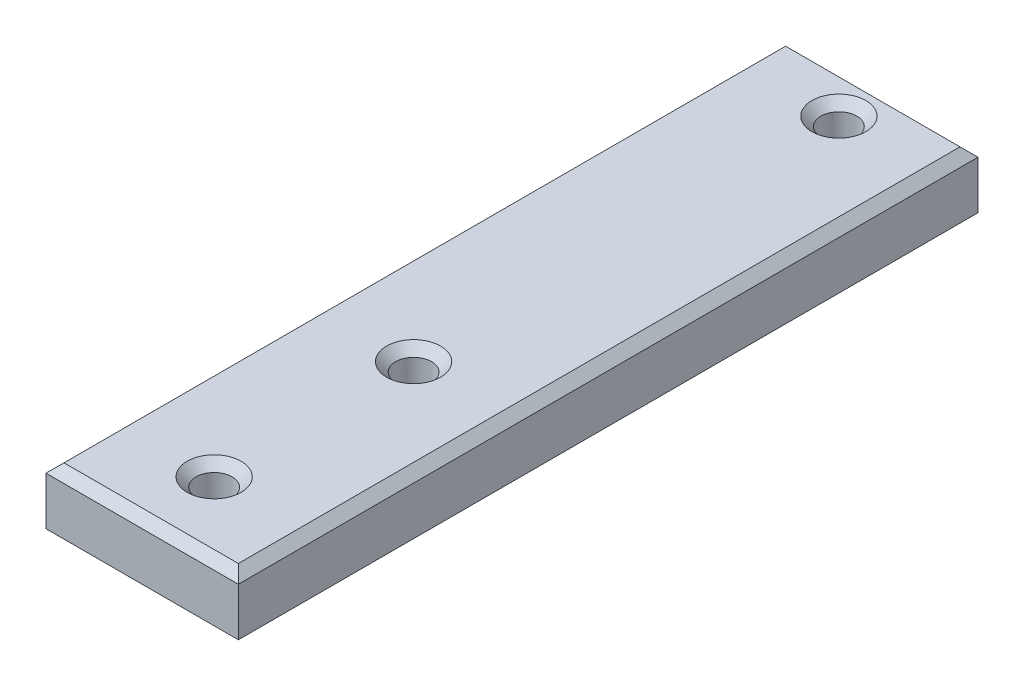
ISO-10303-21;
HEADER;
FILE_DESCRIPTION(('STEP AP214'),'2;1');
FILE_NAME('part.step','',(''),(''),'','','');
FILE_SCHEMA(('AUTOMOTIVE_DESIGN { 1 0 10303 214 1 1 1 1 }'));
ENDSEC;
DATA;
#1=APPLICATION_CONTEXT('core data for automotive mechanical design processes');
#2=APPLICATION_PROTOCOL_DEFINITION('international standard','automotive_design',2000,#1);
#3=PRODUCT_CONTEXT('',#1,'mechanical');
#4=PRODUCT('Part','Part','',(#3));
#5=PRODUCT_RELATED_PRODUCT_CATEGORY('part','',(#4));
#6=PRODUCT_DEFINITION_FORMATION('','',#4);
#7=PRODUCT_DEFINITION_CONTEXT('part definition',#1,'design');
#8=PRODUCT_DEFINITION('design','',#6,#7);
#9=PRODUCT_DEFINITION_SHAPE('','',#8);
#10=(LENGTH_UNIT() NAMED_UNIT(*) SI_UNIT(.MILLI.,.METRE.));
#11=(NAMED_UNIT(*) PLANE_ANGLE_UNIT() SI_UNIT($,.RADIAN.));
#12=(NAMED_UNIT(*) SI_UNIT($,.STERADIAN.) SOLID_ANGLE_UNIT());
#13=UNCERTAINTY_MEASURE_WITH_UNIT(LENGTH_MEASURE(1.E-05),#10,'distance_accuracy_value','');
#14=(GEOMETRIC_REPRESENTATION_CONTEXT(3) GLOBAL_UNCERTAINTY_ASSIGNED_CONTEXT((#13)) GLOBAL_UNIT_ASSIGNED_CONTEXT((#10,
#11,#12)) REPRESENTATION_CONTEXT('',''));
#15=CARTESIAN_POINT('',(0.,0.,0.));
#16=DIRECTION('',(0.,0.,1.));
#17=DIRECTION('',(1.,0.,0.));
#18=AXIS2_PLACEMENT_3D('',#15,#16,#17);
#19=CARTESIAN_POINT('',(0.,6.35,0.));
#20=DIRECTION('',(0.,1.,0.));
#21=DIRECTION('',(0.,0.,1.));
#22=AXIS2_PLACEMENT_3D('',#19,#20,#21);
#23=PLANE('',#22);
#24=CARTESIAN_POINT('',(0.,6.35,26.95));
#25=DIRECTION('',(0.,1.,0.));
#26=DIRECTION('',(0.,0.,1.));
#27=AXIS2_PLACEMENT_3D('',#24,#25,#26);
#28=CIRCLE('',#27,3.00000000000001);
#29=CARTESIAN_POINT('',(0.,6.35,29.95));
#30=VERTEX_POINT('',#29);
#31=EDGE_CURVE('E174',#30,#30,#28,.F.);
#32=ORIENTED_EDGE('',*,*,#31,.T.);
#33=EDGE_LOOP('',(#32));
#34=FACE_BOUND('',#33,.T.);
#35=CARTESIAN_POINT('',(0.,6.35,-42.5));
#36=DIRECTION('',(0.,1.,0.));
#37=DIRECTION('',(0.,0.,1.));
#38=AXIS2_PLACEMENT_3D('',#35,#36,#37);
#39=CIRCLE('',#38,3.00000000000001);
#40=CARTESIAN_POINT('',(0.,6.35,-39.5));
#41=VERTEX_POINT('',#40);
#42=EDGE_CURVE('E170',#41,#41,#39,.F.);
#43=ORIENTED_EDGE('',*,*,#42,.T.);
#44=EDGE_LOOP('',(#43));
#45=FACE_BOUND('',#44,.T.);
#46=DIRECTION('',(1.,0.,0.));
#47=VECTOR('',#46,1.);
#48=CARTESIAN_POINT('',(10.6922410208794,6.35,33.95));
#49=LINE('',#48,#47);
#50=CARTESIAN_POINT('',(-9.6922410208794,6.35,33.95));
#51=VERTEX_POINT('',#50);
#52=CARTESIAN_POINT('',(9.6922410208794,6.35,33.95));
#53=VERTEX_POINT('',#52);
#54=EDGE_CURVE('E163',#51,#53,#49,.T.);
#55=ORIENTED_EDGE('',*,*,#54,.T.);
#56=DIRECTION('',(0.,0.,-1.));
#57=VECTOR('',#56,1.);
#58=CARTESIAN_POINT('',(9.69224102087942,6.35,-47.275));
#59=LINE('',#58,#57);
#60=CARTESIAN_POINT('',(9.69224102087942,6.35,-46.275));
#61=VERTEX_POINT('',#60);
#62=EDGE_CURVE('E166',#53,#61,#59,.T.);
#63=ORIENTED_EDGE('',*,*,#62,.T.);
#64=DIRECTION('',(-1.,0.,0.));
#65=VECTOR('',#64,1.);
#66=CARTESIAN_POINT('',(-10.6922410208794,6.35,-46.275));
#67=LINE('',#66,#65);
#68=CARTESIAN_POINT('',(-9.69224102087942,6.35,-46.275));
#69=VERTEX_POINT('',#68);
#70=EDGE_CURVE('E157',#61,#69,#67,.T.);
#71=ORIENTED_EDGE('',*,*,#70,.T.);
#72=DIRECTION('',(0.,0.,1.));
#73=VECTOR('',#72,1.);
#74=CARTESIAN_POINT('',(-9.6922410208794,6.35,34.95));
#75=LINE('',#74,#73);
#76=EDGE_CURVE('E160',#69,#51,#75,.T.);
#77=ORIENTED_EDGE('',*,*,#76,.T.);
#78=EDGE_LOOP('',(#55,#63,#71,#77));
#79=FACE_BOUND('',#78,.T.);
#80=CARTESIAN_POINT('',(0.,6.35,4.77499999999999));
#81=DIRECTION('',(0.,1.,0.));
#82=DIRECTION('',(0.,0.,1.));
#83=AXIS2_PLACEMENT_3D('',#80,#81,#82);
#84=CIRCLE('',#83,3.00000000000001);
#85=CARTESIAN_POINT('',(0.,6.35,7.775));
#86=VERTEX_POINT('',#85);
#87=EDGE_CURVE('E153',#86,#86,#84,.F.);
#88=ORIENTED_EDGE('',*,*,#87,.T.);
#89=EDGE_LOOP('',(#88));
#90=FACE_BOUND('',#89,.T.);
#91=ADVANCED_FACE('F47',(#34,#45,#79,#90),#23,.T.);
#92=CARTESIAN_POINT('',(0.,0.,0.));
#93=DIRECTION('',(0.,1.,0.));
#94=DIRECTION('',(0.,0.,1.));
#95=AXIS2_PLACEMENT_3D('',#92,#93,#94);
#96=PLANE('',#95);
#97=DIRECTION('',(-1.,0.,0.));
#98=VECTOR('',#97,1.);
#99=CARTESIAN_POINT('',(10.6922410208794,0.,-47.275));
#100=LINE('',#99,#98);
#101=CARTESIAN_POINT('',(10.6922410208794,0.,-47.275));
#102=VERTEX_POINT('',#101);
#103=CARTESIAN_POINT('',(-10.6922410208794,0.,-47.275));
#104=VERTEX_POINT('',#103);
#105=EDGE_CURVE('E120',#102,#104,#100,.T.);
#106=ORIENTED_EDGE('',*,*,#105,.F.);
#107=DIRECTION('',(0.,0.,-1.));
#108=VECTOR('',#107,1.);
#109=CARTESIAN_POINT('',(10.6922410208794,0.,34.95));
#110=LINE('',#109,#108);
#111=CARTESIAN_POINT('',(10.6922410208794,0.,34.95));
#112=VERTEX_POINT('',#111);
#113=EDGE_CURVE('E140',#112,#102,#110,.T.);
#114=ORIENTED_EDGE('',*,*,#113,.F.);
#115=DIRECTION('',(1.,0.,0.));
#116=VECTOR('',#115,1.);
#117=CARTESIAN_POINT('',(-10.6922410208794,0.,34.95));
#118=LINE('',#117,#116);
#119=CARTESIAN_POINT('',(-10.6922410208794,0.,34.95));
#120=VERTEX_POINT('',#119);
#121=EDGE_CURVE('E122',#120,#112,#118,.T.);
#122=ORIENTED_EDGE('',*,*,#121,.F.);
#123=DIRECTION('',(0.,0.,1.));
#124=VECTOR('',#123,1.);
#125=CARTESIAN_POINT('',(-10.6922410208794,0.,-47.275));
#126=LINE('',#125,#124);
#127=EDGE_CURVE('E106',#104,#120,#126,.T.);
#128=ORIENTED_EDGE('',*,*,#127,.F.);
#129=EDGE_LOOP('',(#106,#114,#122,#128));
#130=FACE_BOUND('',#129,.T.);
#131=CARTESIAN_POINT('',(0.,0.,-42.5));
#132=DIRECTION('',(0.,1.,0.));
#133=DIRECTION('',(0.,0.,1.));
#134=AXIS2_PLACEMENT_3D('',#131,#132,#133);
#135=CIRCLE('',#134,2.);
#136=CARTESIAN_POINT('',(0.,0.,-40.5));
#137=VERTEX_POINT('',#136);
#138=EDGE_CURVE('E130',#137,#137,#135,.T.);
#139=ORIENTED_EDGE('',*,*,#138,.T.);
#140=EDGE_LOOP('',(#139));
#141=FACE_BOUND('',#140,.T.);
#142=CARTESIAN_POINT('',(0.,0.,4.77499999999999));
#143=DIRECTION('',(0.,1.,0.));
#144=DIRECTION('',(0.,0.,-1.));
#145=AXIS2_PLACEMENT_3D('',#142,#143,#144);
#146=CIRCLE('',#145,2.);
#147=CARTESIAN_POINT('',(0.,0.,2.775));
#148=VERTEX_POINT('',#147);
#149=EDGE_CURVE('E134',#148,#148,#146,.T.);
#150=ORIENTED_EDGE('',*,*,#149,.T.);
#151=EDGE_LOOP('',(#150));
#152=FACE_BOUND('',#151,.T.);
#153=CARTESIAN_POINT('',(0.,0.,26.95));
#154=DIRECTION('',(0.,1.,0.));
#155=DIRECTION('',(0.,0.,1.));
#156=AXIS2_PLACEMENT_3D('',#153,#154,#155);
#157=CIRCLE('',#156,2.);
#158=CARTESIAN_POINT('',(0.,0.,28.95));
#159=VERTEX_POINT('',#158);
#160=EDGE_CURVE('E205',#159,#159,#157,.T.);
#161=ORIENTED_EDGE('',*,*,#160,.T.);
#162=EDGE_LOOP('',(#161));
#163=FACE_BOUND('',#162,.T.);
#164=ADVANCED_FACE('F117',(#130,#141,#152,#163),#96,.F.);
#165=CARTESIAN_POINT('',(10.6922410208794,6.35,-47.275));
#166=DIRECTION('',(0.,0.,1.));
#167=DIRECTION('',(1.,0.,0.));
#168=AXIS2_PLACEMENT_3D('',#165,#166,#167);
#169=PLANE('',#168);
#170=DIRECTION('',(0.,-1.,0.));
#171=VECTOR('',#170,1.);
#172=CARTESIAN_POINT('',(-10.6922410208794,6.35,-47.275));
#173=LINE('',#172,#171);
#174=CARTESIAN_POINT('',(-10.6922410208794,5.35,-47.275));
#175=VERTEX_POINT('',#174);
#176=EDGE_CURVE('E103',#175,#104,#173,.T.);
#177=ORIENTED_EDGE('',*,*,#176,.F.);
#178=DIRECTION('',(1.,0.,0.));
#179=VECTOR('',#178,1.);
#180=CARTESIAN_POINT('',(10.6922410208794,5.35,-47.275));
#181=LINE('',#180,#179);
#182=CARTESIAN_POINT('',(10.6922410208794,5.35,-47.275));
#183=VERTEX_POINT('',#182);
#184=EDGE_CURVE('E58',#175,#183,#181,.T.);
#185=ORIENTED_EDGE('',*,*,#184,.T.);
#186=DIRECTION('',(0.,-1.,0.));
#187=VECTOR('',#186,1.);
#188=CARTESIAN_POINT('',(10.6922410208794,6.35,-47.275));
#189=LINE('',#188,#187);
#190=EDGE_CURVE('E127',#183,#102,#189,.T.);
#191=ORIENTED_EDGE('',*,*,#190,.T.);
#192=ORIENTED_EDGE('',*,*,#105,.T.);
#193=EDGE_LOOP('',(#177,#185,#191,#192));
#194=FACE_BOUND('',#193,.T.);
#195=ADVANCED_FACE('F125',(#194),#169,.F.);
#196=CARTESIAN_POINT('',(-10.6922410208794,6.35,-47.275));
#197=DIRECTION('',(1.,0.,0.));
#198=DIRECTION('',(0.,0.,-1.));
#199=AXIS2_PLACEMENT_3D('',#196,#197,#198);
#200=PLANE('',#199);
#201=DIRECTION('',(0.,-1.,0.));
#202=VECTOR('',#201,1.);
#203=CARTESIAN_POINT('',(-10.6922410208794,6.35,34.95));
#204=LINE('',#203,#202);
#205=CARTESIAN_POINT('',(-10.6922410208794,5.35,34.95));
#206=VERTEX_POINT('',#205);
#207=EDGE_CURVE('E113',#206,#120,#204,.T.);
#208=ORIENTED_EDGE('',*,*,#207,.F.);
#209=DIRECTION('',(0.,0.,-1.));
#210=VECTOR('',#209,1.);
#211=CARTESIAN_POINT('',(-10.6922410208794,5.35,-47.275));
#212=LINE('',#211,#210);
#213=EDGE_CURVE('E66',#206,#175,#212,.T.);
#214=ORIENTED_EDGE('',*,*,#213,.T.);
#215=ORIENTED_EDGE('',*,*,#176,.T.);
#216=ORIENTED_EDGE('',*,*,#127,.T.);
#217=EDGE_LOOP('',(#208,#214,#215,#216));
#218=FACE_BOUND('',#217,.T.);
#219=ADVANCED_FACE('F105',(#218),#200,.F.);
#220=CARTESIAN_POINT('',(-10.6922410208794,6.35,34.95));
#221=DIRECTION('',(0.,0.,-1.));
#222=DIRECTION('',(-1.,0.,0.));
#223=AXIS2_PLACEMENT_3D('',#220,#221,#222);
#224=PLANE('',#223);
#225=DIRECTION('',(0.,-1.,0.));
#226=VECTOR('',#225,1.);
#227=CARTESIAN_POINT('',(10.6922410208794,6.35,34.95));
#228=LINE('',#227,#226);
#229=CARTESIAN_POINT('',(10.6922410208794,5.35,34.95));
#230=VERTEX_POINT('',#229);
#231=EDGE_CURVE('E145',#230,#112,#228,.T.);
#232=ORIENTED_EDGE('',*,*,#231,.F.);
#233=DIRECTION('',(-1.,0.,0.));
#234=VECTOR('',#233,1.);
#235=CARTESIAN_POINT('',(-10.6922410208794,5.35,34.95));
#236=LINE('',#235,#234);
#237=EDGE_CURVE('E74',#230,#206,#236,.T.);
#238=ORIENTED_EDGE('',*,*,#237,.T.);
#239=ORIENTED_EDGE('',*,*,#207,.T.);
#240=ORIENTED_EDGE('',*,*,#121,.T.);
#241=EDGE_LOOP('',(#232,#238,#239,#240));
#242=FACE_BOUND('',#241,.T.);
#243=ADVANCED_FACE('F247',(#242),#224,.F.);
#244=CARTESIAN_POINT('',(10.6922410208794,6.35,34.95));
#245=DIRECTION('',(-1.,0.,0.));
#246=DIRECTION('',(0.,0.,1.));
#247=AXIS2_PLACEMENT_3D('',#244,#245,#246);
#248=PLANE('',#247);
#249=ORIENTED_EDGE('',*,*,#190,.F.);
#250=DIRECTION('',(0.,0.,1.));
#251=VECTOR('',#250,1.);
#252=CARTESIAN_POINT('',(10.6922410208794,5.35,34.95));
#253=LINE('',#252,#251);
#254=EDGE_CURVE('E182',#183,#230,#253,.T.);
#255=ORIENTED_EDGE('',*,*,#254,.T.);
#256=ORIENTED_EDGE('',*,*,#231,.T.);
#257=ORIENTED_EDGE('',*,*,#113,.T.);
#258=EDGE_LOOP('',(#249,#255,#256,#257));
#259=FACE_BOUND('',#258,.T.);
#260=ADVANCED_FACE('F232',(#259),#248,.F.);
#261=CARTESIAN_POINT('',(0.,6.35,-42.5));
#262=DIRECTION('',(0.,-1.,0.));
#263=DIRECTION('',(0.,0.,-1.));
#264=AXIS2_PLACEMENT_3D('',#261,#262,#263);
#265=CYLINDRICAL_SURFACE('',#264,2.);
#266=CARTESIAN_POINT('',(0.,5.35,-42.5));
#267=DIRECTION('',(0.,1.,0.));
#268=DIRECTION('',(0.,0.,1.));
#269=AXIS2_PLACEMENT_3D('',#266,#267,#268);
#270=CIRCLE('',#269,2.);
#271=CARTESIAN_POINT('',(0.,5.35,-40.5));
#272=VERTEX_POINT('',#271);
#273=EDGE_CURVE('E178',#272,#272,#270,.T.);
#274=ORIENTED_EDGE('',*,*,#273,.T.);
#275=EDGE_LOOP('',(#274));
#276=FACE_BOUND('',#275,.T.);
#277=ORIENTED_EDGE('',*,*,#138,.F.);
#278=EDGE_LOOP('',(#277));
#279=FACE_BOUND('',#278,.T.);
#280=ADVANCED_FACE('F222',(#276,#279),#265,.F.);
#281=CARTESIAN_POINT('',(0.,6.35,4.77499999999999));
#282=DIRECTION('',(0.,-1.,0.));
#283=DIRECTION('',(0.,0.,-1.));
#284=AXIS2_PLACEMENT_3D('',#281,#282,#283);
#285=CYLINDRICAL_SURFACE('',#284,2.);
#286=CARTESIAN_POINT('',(0.,5.35,4.77499999999999));
#287=DIRECTION('',(0.,1.,0.));
#288=DIRECTION('',(0.,0.,1.));
#289=AXIS2_PLACEMENT_3D('',#286,#287,#288);
#290=CIRCLE('',#289,2.);
#291=CARTESIAN_POINT('',(0.,5.35,6.77499999999999));
#292=VERTEX_POINT('',#291);
#293=EDGE_CURVE('E11',#292,#292,#290,.T.);
#294=ORIENTED_EDGE('',*,*,#293,.T.);
#295=EDGE_LOOP('',(#294));
#296=FACE_BOUND('',#295,.T.);
#297=ORIENTED_EDGE('',*,*,#149,.F.);
#298=EDGE_LOOP('',(#297));
#299=FACE_BOUND('',#298,.T.);
#300=ADVANCED_FACE('F219',(#296,#299),#285,.F.);
#301=CARTESIAN_POINT('',(0.,6.35,26.95));
#302=DIRECTION('',(0.,-1.,0.));
#303=DIRECTION('',(0.,0.,-1.));
#304=AXIS2_PLACEMENT_3D('',#301,#302,#303);
#305=CYLINDRICAL_SURFACE('',#304,2.);
#306=CARTESIAN_POINT('',(0.,5.35,26.95));
#307=DIRECTION('',(0.,1.,0.));
#308=DIRECTION('',(0.,0.,1.));
#309=AXIS2_PLACEMENT_3D('',#306,#307,#308);
#310=CIRCLE('',#309,2.);
#311=CARTESIAN_POINT('',(0.,5.35,28.95));
#312=VERTEX_POINT('',#311);
#313=EDGE_CURVE('E112',#312,#312,#310,.T.);
#314=ORIENTED_EDGE('',*,*,#313,.T.);
#315=EDGE_LOOP('',(#314));
#316=FACE_BOUND('',#315,.T.);
#317=ORIENTED_EDGE('',*,*,#160,.F.);
#318=EDGE_LOOP('',(#317));
#319=FACE_BOUND('',#318,.T.);
#320=ADVANCED_FACE('F221',(#316,#319),#305,.F.);
#321=CARTESIAN_POINT('',(0.,5.35,26.95));
#322=DIRECTION('',(0.,1.,0.));
#323=DIRECTION('',(0.,0.,1.));
#324=AXIS2_PLACEMENT_3D('',#321,#322,#323);
#325=CONICAL_SURFACE('',#324,2.,0.785398163397452);
#326=ORIENTED_EDGE('',*,*,#31,.F.);
#327=EDGE_LOOP('',(#326));
#328=FACE_BOUND('',#327,.T.);
#329=ORIENTED_EDGE('',*,*,#313,.F.);
#330=EDGE_LOOP('',(#329));
#331=FACE_BOUND('',#330,.T.);
#332=ADVANCED_FACE('F229',(#328,#331),#325,.F.);
#333=CARTESIAN_POINT('',(0.,5.35,-42.5));
#334=DIRECTION('',(0.,1.,0.));
#335=DIRECTION('',(0.,0.,1.));
#336=AXIS2_PLACEMENT_3D('',#333,#334,#335);
#337=CONICAL_SURFACE('',#336,2.,0.785398163397451);
#338=ORIENTED_EDGE('',*,*,#42,.F.);
#339=EDGE_LOOP('',(#338));
#340=FACE_BOUND('',#339,.T.);
#341=ORIENTED_EDGE('',*,*,#273,.F.);
#342=EDGE_LOOP('',(#341));
#343=FACE_BOUND('',#342,.T.);
#344=ADVANCED_FACE('F260',(#340,#343),#337,.F.);
#345=CARTESIAN_POINT('',(-9.69224102087941,6.35,0.));
#346=DIRECTION('',(-0.70710678118655,0.707106781186545,0.));
#347=DIRECTION('',(0.,0.,-1.));
#348=AXIS2_PLACEMENT_3D('',#345,#346,#347);
#349=PLANE('',#348);
#350=DIRECTION('',(0.577350269189625,0.577350269189629,0.577350269189624));
#351=VECTOR('',#350,1.);
#352=CARTESIAN_POINT('',(-6.46149401391962,9.58074700695981,-43.0442529930402));
#353=LINE('',#352,#351);
#354=EDGE_CURVE('E197',#175,#69,#353,.T.);
#355=ORIENTED_EDGE('',*,*,#354,.F.);
#356=ORIENTED_EDGE('',*,*,#213,.F.);
#357=DIRECTION('',(0.577350269189624,0.577350269189628,-0.577350269189624));
#358=VECTOR('',#357,1.);
#359=CARTESIAN_POINT('',(1.62442564578721,17.6666666666667,22.6333333333334));
#360=LINE('',#359,#358);
#361=EDGE_CURVE('E52',#51,#206,#360,.F.);
#362=ORIENTED_EDGE('',*,*,#361,.F.);
#363=ORIENTED_EDGE('',*,*,#76,.F.);
#364=EDGE_LOOP('',(#355,#356,#362,#363));
#365=FACE_BOUND('',#364,.T.);
#366=ADVANCED_FACE('F267',(#365),#349,.T.);
#367=CARTESIAN_POINT('',(0.,6.35,33.95));
#368=DIRECTION('',(0.,0.707106781186545,0.70710678118655));
#369=DIRECTION('',(-1.,0.,0.));
#370=AXIS2_PLACEMENT_3D('',#367,#368,#369);
#371=PLANE('',#370);
#372=ORIENTED_EDGE('',*,*,#361,.T.);
#373=ORIENTED_EDGE('',*,*,#237,.F.);
#374=DIRECTION('',(-0.577350269189624,0.577350269189628,-0.577350269189624));
#375=VECTOR('',#374,1.);
#376=CARTESIAN_POINT('',(6.46149401391961,9.58074700695981,30.7192529930402));
#377=LINE('',#376,#375);
#378=EDGE_CURVE('E195',#53,#230,#377,.F.);
#379=ORIENTED_EDGE('',*,*,#378,.F.);
#380=ORIENTED_EDGE('',*,*,#54,.F.);
#381=EDGE_LOOP('',(#372,#373,#379,#380));
#382=FACE_BOUND('',#381,.T.);
#383=ADVANCED_FACE('F283',(#382),#371,.T.);
#384=CARTESIAN_POINT('',(0.,6.35,-46.275));
#385=DIRECTION('',(0.,0.707106781186545,-0.70710678118655));
#386=DIRECTION('',(1.,0.,0.));
#387=AXIS2_PLACEMENT_3D('',#384,#385,#386);
#388=PLANE('',#387);
#389=ORIENTED_EDGE('',*,*,#354,.T.);
#390=ORIENTED_EDGE('',*,*,#70,.F.);
#391=DIRECTION('',(0.577350269189625,-0.577350269189629,-0.577350269189624));
#392=VECTOR('',#391,1.);
#393=CARTESIAN_POINT('',(6.46149401391962,9.58074700695981,-43.0442529930402));
#394=LINE('',#393,#392);
#395=EDGE_CURVE('E192',#183,#61,#394,.F.);
#396=ORIENTED_EDGE('',*,*,#395,.F.);
#397=ORIENTED_EDGE('',*,*,#184,.F.);
#398=EDGE_LOOP('',(#389,#390,#396,#397));
#399=FACE_BOUND('',#398,.T.);
#400=ADVANCED_FACE('F276',(#399),#388,.T.);
#401=CARTESIAN_POINT('',(9.69224102087941,6.35,0.));
#402=DIRECTION('',(0.70710678118655,0.707106781186545,0.));
#403=DIRECTION('',(0.,0.,1.));
#404=AXIS2_PLACEMENT_3D('',#401,#402,#403);
#405=PLANE('',#404);
#406=ORIENTED_EDGE('',*,*,#378,.T.);
#407=ORIENTED_EDGE('',*,*,#254,.F.);
#408=ORIENTED_EDGE('',*,*,#395,.T.);
#409=ORIENTED_EDGE('',*,*,#62,.F.);
#410=EDGE_LOOP('',(#406,#407,#408,#409));
#411=FACE_BOUND('',#410,.T.);
#412=ADVANCED_FACE('F270',(#411),#405,.T.);
#413=CARTESIAN_POINT('',(0.,5.35,4.77499999999999));
#414=DIRECTION('',(0.,1.,0.));
#415=DIRECTION('',(0.,0.,1.));
#416=AXIS2_PLACEMENT_3D('',#413,#414,#415);
#417=CONICAL_SURFACE('',#416,2.,0.785398163397452);
#418=ORIENTED_EDGE('',*,*,#87,.F.);
#419=EDGE_LOOP('',(#418));
#420=FACE_BOUND('',#419,.T.);
#421=ORIENTED_EDGE('',*,*,#293,.F.);
#422=EDGE_LOOP('',(#421));
#423=FACE_BOUND('',#422,.T.);
#424=ADVANCED_FACE('F50',(#420,#423),#417,.F.);
#425=CLOSED_SHELL('',(#91,#164,#195,#219,#243,#260,#280,#300,#320,#332,#344,#366,#383,#400,#412,#424));
#426=MANIFOLD_SOLID_BREP('B2',#425);
#427=ADVANCED_BREP_SHAPE_REPRESENTATION('',(#18,#426),#14);
#428=SHAPE_DEFINITION_REPRESENTATION(#9,#427);
ENDSEC;
END-ISO-10303-21;
